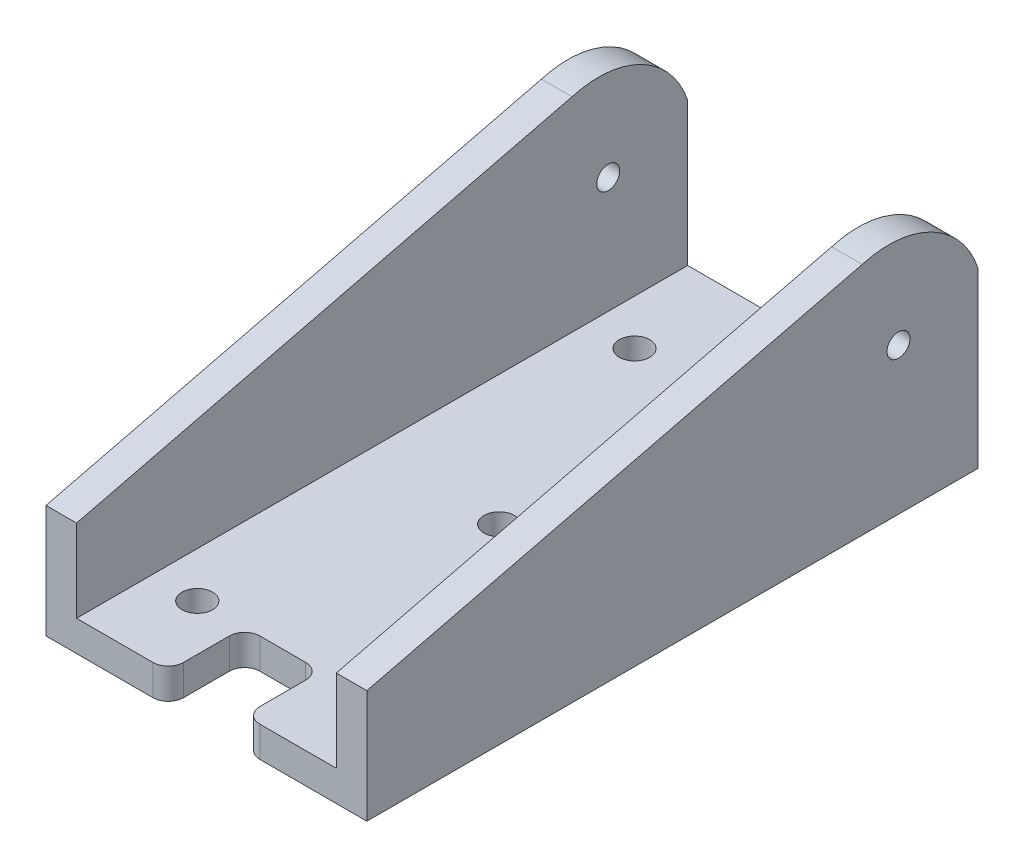
ISO-10303-21;
HEADER;
FILE_DESCRIPTION(('STEP AP214'),'2;1');
FILE_NAME('part.step','',(''),(''),'','','');
FILE_SCHEMA(('AUTOMOTIVE_DESIGN { 1 0 10303 214 1 1 1 1 }'));
ENDSEC;
DATA;
#1=APPLICATION_CONTEXT('core data for automotive mechanical design processes');
#2=APPLICATION_PROTOCOL_DEFINITION('international standard','automotive_design',2000,#1);
#3=PRODUCT_CONTEXT('',#1,'mechanical');
#4=PRODUCT('Part','Part','',(#3));
#5=PRODUCT_RELATED_PRODUCT_CATEGORY('part','',(#4));
#6=PRODUCT_DEFINITION_FORMATION('','',#4);
#7=PRODUCT_DEFINITION_CONTEXT('part definition',#1,'design');
#8=PRODUCT_DEFINITION('design','',#6,#7);
#9=PRODUCT_DEFINITION_SHAPE('','',#8);
#10=(LENGTH_UNIT() NAMED_UNIT(*) SI_UNIT(.MILLI.,.METRE.));
#11=(NAMED_UNIT(*) PLANE_ANGLE_UNIT() SI_UNIT($,.RADIAN.));
#12=(NAMED_UNIT(*) SI_UNIT($,.STERADIAN.) SOLID_ANGLE_UNIT());
#13=UNCERTAINTY_MEASURE_WITH_UNIT(LENGTH_MEASURE(1.E-05),#10,'distance_accuracy_value','');
#14=(GEOMETRIC_REPRESENTATION_CONTEXT(3) GLOBAL_UNCERTAINTY_ASSIGNED_CONTEXT((#13)) GLOBAL_UNIT_ASSIGNED_CONTEXT((#10,
#11,#12)) REPRESENTATION_CONTEXT('',''));
#15=CARTESIAN_POINT('',(0.,0.,0.));
#16=DIRECTION('',(0.,0.,1.));
#17=DIRECTION('',(1.,0.,0.));
#18=AXIS2_PLACEMENT_3D('',#15,#16,#17);
#19=CARTESIAN_POINT('',(5.25,4.72035020731188,-7.07510689997328));
#20=DIRECTION('',(-1.,0.,0.));
#21=DIRECTION('',(0.,0.,1.));
#22=AXIS2_PLACEMENT_3D('',#19,#20,#21);
#23=CYLINDRICAL_SURFACE('',#22,3.07708407349778);
#24=CARTESIAN_POINT('',(-4.25,4.72035020731188,-7.07510689997328));
#25=DIRECTION('',(1.,0.,0.));
#26=DIRECTION('',(0.,0.,-1.));
#27=AXIS2_PLACEMENT_3D('',#24,#25,#26);
#28=CIRCLE('',#27,3.07708407349778);
#29=CARTESIAN_POINT('',(-4.25,7.67432555061169,-6.21343639070045));
#30=VERTEX_POINT('',#29);
#31=CARTESIAN_POINT('',(-4.25,5.67609428853329,-10.));
#32=VERTEX_POINT('',#31);
#33=EDGE_CURVE('E231',#30,#32,#28,.F.);
#34=ORIENTED_EDGE('',*,*,#33,.T.);
#35=DIRECTION('',(-1.,0.,0.));
#36=VECTOR('',#35,1.);
#37=CARTESIAN_POINT('',(5.25,5.6760942885333,-10.));
#38=LINE('',#37,#36);
#39=CARTESIAN_POINT('',(-5.25,5.6760942885333,-10.));
#40=VERTEX_POINT('',#39);
#41=EDGE_CURVE('E198',#32,#40,#38,.T.);
#42=ORIENTED_EDGE('',*,*,#41,.T.);
#43=CARTESIAN_POINT('',(-5.25,4.72035020731188,-7.07510689997328));
#44=DIRECTION('',(1.,0.,0.));
#45=DIRECTION('',(0.,0.,-1.));
#46=AXIS2_PLACEMENT_3D('',#43,#44,#45);
#47=CIRCLE('',#46,3.07708407349778);
#48=CARTESIAN_POINT('',(-5.25,7.67432555061169,-6.21343639070045));
#49=VERTEX_POINT('',#48);
#50=EDGE_CURVE('E207',#40,#49,#47,.T.);
#51=ORIENTED_EDGE('',*,*,#50,.T.);
#52=DIRECTION('',(-1.,0.,0.));
#53=VECTOR('',#52,1.);
#54=CARTESIAN_POINT('',(5.25,7.67432555061169,-6.21343639070045));
#55=LINE('',#54,#53);
#56=EDGE_CURVE('E218',#30,#49,#55,.T.);
#57=ORIENTED_EDGE('',*,*,#56,.F.);
#58=EDGE_LOOP('',(#34,#42,#51,#57));
#59=FACE_BOUND('',#58,.T.);
#60=ADVANCED_FACE('F44',(#59),#23,.T.);
#61=CARTESIAN_POINT('',(5.25,10.,10.));
#62=DIRECTION('',(0.,0.,-1.));
#63=DIRECTION('',(-1.,0.,0.));
#64=AXIS2_PLACEMENT_3D('',#61,#62,#63);
#65=PLANE('',#64);
#66=DIRECTION('',(1.,0.,0.));
#67=VECTOR('',#66,1.);
#68=CARTESIAN_POINT('',(5.25,0.,10.));
#69=LINE('',#68,#67);
#70=CARTESIAN_POINT('',(-5.25,0.,10.));
#71=VERTEX_POINT('',#70);
#72=CARTESIAN_POINT('',(-1.75,0.,10.));
#73=VERTEX_POINT('',#72);
#74=EDGE_CURVE('E261',#71,#73,#69,.T.);
#75=ORIENTED_EDGE('',*,*,#74,.T.);
#76=DIRECTION('',(0.,-1.,0.));
#77=VECTOR('',#76,1.);
#78=CARTESIAN_POINT('',(-1.75,10.,10.));
#79=LINE('',#78,#77);
#80=CARTESIAN_POINT('',(-1.75,0.999999999999999,10.));
#81=VERTEX_POINT('',#80);
#82=EDGE_CURVE('E295',#73,#81,#79,.F.);
#83=ORIENTED_EDGE('',*,*,#82,.T.);
#84=DIRECTION('',(1.,0.,0.));
#85=VECTOR('',#84,1.);
#86=CARTESIAN_POINT('',(5.25,0.999999999999999,10.));
#87=LINE('',#86,#85);
#88=CARTESIAN_POINT('',(-4.25,1.,10.));
#89=VERTEX_POINT('',#88);
#90=EDGE_CURVE('E252',#89,#81,#87,.T.);
#91=ORIENTED_EDGE('',*,*,#90,.F.);
#92=DIRECTION('',(0.,-1.,0.));
#93=VECTOR('',#92,1.);
#94=CARTESIAN_POINT('',(-4.25,10.,10.));
#95=LINE('',#94,#93);
#96=CARTESIAN_POINT('',(-4.25,3.69945515693264,10.));
#97=VERTEX_POINT('',#96);
#98=EDGE_CURVE('E180',#97,#89,#95,.T.);
#99=ORIENTED_EDGE('',*,*,#98,.F.);
#100=DIRECTION('',(-1.,0.,0.));
#101=VECTOR('',#100,1.);
#102=CARTESIAN_POINT('',(5.25,3.69945515693264,10.));
#103=LINE('',#102,#101);
#104=CARTESIAN_POINT('',(-5.25,3.69945515693264,10.));
#105=VERTEX_POINT('',#104);
#106=EDGE_CURVE('E226',#97,#105,#103,.T.);
#107=ORIENTED_EDGE('',*,*,#106,.T.);
#108=DIRECTION('',(0.,-1.,0.));
#109=VECTOR('',#108,1.);
#110=CARTESIAN_POINT('',(-5.25,10.,10.));
#111=LINE('',#110,#109);
#112=EDGE_CURVE('E277',#105,#71,#111,.T.);
#113=ORIENTED_EDGE('',*,*,#112,.T.);
#114=EDGE_LOOP('',(#75,#83,#91,#99,#107,#113));
#115=FACE_BOUND('',#114,.T.);
#116=ADVANCED_FACE('F365',(#115),#65,.F.);
#117=CARTESIAN_POINT('',(1.75,0.999999999999999,10.));
#118=VERTEX_POINT('',#117);
#119=CARTESIAN_POINT('',(4.25,1.,10.));
#120=VERTEX_POINT('',#119);
#121=EDGE_CURVE('E183',#118,#120,#87,.T.);
#122=ORIENTED_EDGE('',*,*,#121,.F.);
#123=DIRECTION('',(0.,-1.,0.));
#124=VECTOR('',#123,1.);
#125=CARTESIAN_POINT('',(1.75,10.,10.));
#126=LINE('',#125,#124);
#127=CARTESIAN_POINT('',(1.75,0.,10.));
#128=VERTEX_POINT('',#127);
#129=EDGE_CURVE('E300',#118,#128,#126,.T.);
#130=ORIENTED_EDGE('',*,*,#129,.T.);
#131=CARTESIAN_POINT('',(5.25,0.,10.));
#132=VERTEX_POINT('',#131);
#133=EDGE_CURVE('E260',#128,#132,#69,.T.);
#134=ORIENTED_EDGE('',*,*,#133,.T.);
#135=DIRECTION('',(0.,-1.,0.));
#136=VECTOR('',#135,1.);
#137=CARTESIAN_POINT('',(5.25,10.,10.));
#138=LINE('',#137,#136);
#139=CARTESIAN_POINT('',(5.25,3.69945515693264,10.));
#140=VERTEX_POINT('',#139);
#141=EDGE_CURVE('E274',#140,#132,#138,.T.);
#142=ORIENTED_EDGE('',*,*,#141,.F.);
#143=CARTESIAN_POINT('',(4.25,3.69945515693264,10.));
#144=VERTEX_POINT('',#143);
#145=EDGE_CURVE('E223',#140,#144,#103,.T.);
#146=ORIENTED_EDGE('',*,*,#145,.T.);
#147=DIRECTION('',(0.,-1.,0.));
#148=VECTOR('',#147,1.);
#149=CARTESIAN_POINT('',(4.25,10.,10.));
#150=LINE('',#149,#148);
#151=EDGE_CURVE('E251',#144,#120,#150,.T.);
#152=ORIENTED_EDGE('',*,*,#151,.T.);
#153=EDGE_LOOP('',(#122,#130,#134,#142,#146,#152));
#154=FACE_BOUND('',#153,.T.);
#155=ADVANCED_FACE('F330',(#154),#65,.F.);
#156=CARTESIAN_POINT('',(-5.25,10.,10.));
#157=DIRECTION('',(1.,0.,0.));
#158=DIRECTION('',(0.,0.,-1.));
#159=AXIS2_PLACEMENT_3D('',#156,#157,#158);
#160=PLANE('',#159);
#161=CARTESIAN_POINT('',(-5.25,4.79610799591964,-7.39805085385863));
#162=DIRECTION('',(1.,0.,0.));
#163=DIRECTION('',(0.,0.,-1.));
#164=AXIS2_PLACEMENT_3D('',#161,#162,#163);
#165=CIRCLE('',#164,0.375);
#166=CARTESIAN_POINT('',(-5.25,4.79610799591964,-7.77305085385863));
#167=VERTEX_POINT('',#166);
#168=EDGE_CURVE('E199',#167,#167,#165,.T.);
#169=ORIENTED_EDGE('',*,*,#168,.T.);
#170=EDGE_LOOP('',(#169));
#171=FACE_BOUND('',#170,.T.);
#172=DIRECTION('',(0.,-0.238107940431499,0.971238698108487));
#173=VECTOR('',#172,1.);
#174=CARTESIAN_POINT('',(-5.25,7.67432555061169,-6.21343639070045));
#175=LINE('',#174,#173);
#176=EDGE_CURVE('E210',#49,#105,#175,.T.);
#177=ORIENTED_EDGE('',*,*,#176,.F.);
#178=ORIENTED_EDGE('',*,*,#50,.F.);
#179=DIRECTION('',(0.,-1.,0.));
#180=VECTOR('',#179,1.);
#181=CARTESIAN_POINT('',(-5.25,10.,-10.));
#182=LINE('',#181,#180);
#183=CARTESIAN_POINT('',(-5.25,0.,-10.));
#184=VERTEX_POINT('',#183);
#185=EDGE_CURVE('E270',#40,#184,#182,.T.);
#186=ORIENTED_EDGE('',*,*,#185,.T.);
#187=DIRECTION('',(0.,0.,1.));
#188=VECTOR('',#187,1.);
#189=CARTESIAN_POINT('',(-5.25,0.,10.));
#190=LINE('',#189,#188);
#191=EDGE_CURVE('E254',#184,#71,#190,.T.);
#192=ORIENTED_EDGE('',*,*,#191,.T.);
#193=ORIENTED_EDGE('',*,*,#112,.F.);
#194=EDGE_LOOP('',(#177,#178,#186,#192,#193));
#195=FACE_BOUND('',#194,.T.);
#196=ADVANCED_FACE('F395',(#171,#195),#160,.F.);
#197=CARTESIAN_POINT('',(5.25,10.,10.));
#198=DIRECTION('',(-1.,0.,0.));
#199=DIRECTION('',(0.,0.,1.));
#200=AXIS2_PLACEMENT_3D('',#197,#198,#199);
#201=PLANE('',#200);
#202=CARTESIAN_POINT('',(5.25,4.79610799591964,-7.39805085385863));
#203=DIRECTION('',(-1.,0.,0.));
#204=DIRECTION('',(0.,0.,1.));
#205=AXIS2_PLACEMENT_3D('',#202,#203,#204);
#206=CIRCLE('',#205,0.375);
#207=CARTESIAN_POINT('',(5.25,4.79610799591964,-7.02305085385863));
#208=VERTEX_POINT('',#207);
#209=EDGE_CURVE('E476',#208,#208,#206,.T.);
#210=ORIENTED_EDGE('',*,*,#209,.T.);
#211=EDGE_LOOP('',(#210));
#212=FACE_BOUND('',#211,.T.);
#213=DIRECTION('',(0.,-1.,0.));
#214=VECTOR('',#213,1.);
#215=CARTESIAN_POINT('',(5.25,10.,-10.));
#216=LINE('',#215,#214);
#217=CARTESIAN_POINT('',(5.25,5.6760942885333,-10.));
#218=VERTEX_POINT('',#217);
#219=CARTESIAN_POINT('',(5.25,0.,-10.));
#220=VERTEX_POINT('',#219);
#221=EDGE_CURVE('E272',#218,#220,#216,.T.);
#222=ORIENTED_EDGE('',*,*,#221,.F.);
#223=CARTESIAN_POINT('',(5.25,4.72035020731188,-7.07510689997328));
#224=DIRECTION('',(1.,0.,0.));
#225=DIRECTION('',(0.,0.,-1.));
#226=AXIS2_PLACEMENT_3D('',#223,#224,#225);
#227=CIRCLE('',#226,3.07708407349778);
#228=CARTESIAN_POINT('',(5.25,7.67432555061169,-6.21343639070045));
#229=VERTEX_POINT('',#228);
#230=EDGE_CURVE('E212',#218,#229,#227,.T.);
#231=ORIENTED_EDGE('',*,*,#230,.T.);
#232=DIRECTION('',(0.,-0.238107940431499,0.971238698108487));
#233=VECTOR('',#232,1.);
#234=CARTESIAN_POINT('',(5.25,7.67432555061169,-6.21343639070045));
#235=LINE('',#234,#233);
#236=EDGE_CURVE('E215',#229,#140,#235,.T.);
#237=ORIENTED_EDGE('',*,*,#236,.T.);
#238=ORIENTED_EDGE('',*,*,#141,.T.);
#239=DIRECTION('',(0.,0.,-1.));
#240=VECTOR('',#239,1.);
#241=CARTESIAN_POINT('',(5.25,0.,10.));
#242=LINE('',#241,#240);
#243=EDGE_CURVE('E264',#132,#220,#242,.T.);
#244=ORIENTED_EDGE('',*,*,#243,.T.);
#245=EDGE_LOOP('',(#222,#231,#237,#238,#244));
#246=FACE_BOUND('',#245,.T.);
#247=ADVANCED_FACE('F337',(#212,#246),#201,.F.);
#248=CARTESIAN_POINT('',(5.25,10.,-10.));
#249=DIRECTION('',(0.,0.,1.));
#250=DIRECTION('',(1.,0.,0.));
#251=AXIS2_PLACEMENT_3D('',#248,#249,#250);
#252=PLANE('',#251);
#253=ORIENTED_EDGE('',*,*,#41,.F.);
#254=DIRECTION('',(0.,-1.,0.));
#255=VECTOR('',#254,1.);
#256=CARTESIAN_POINT('',(-4.25,7.12102364383822,-10.));
#257=LINE('',#256,#255);
#258=CARTESIAN_POINT('',(-4.25,1.,-10.));
#259=VERTEX_POINT('',#258);
#260=EDGE_CURVE('E176',#32,#259,#257,.T.);
#261=ORIENTED_EDGE('',*,*,#260,.T.);
#262=DIRECTION('',(1.,0.,0.));
#263=VECTOR('',#262,1.);
#264=CARTESIAN_POINT('',(-4.25,1.,-10.));
#265=LINE('',#264,#263);
#266=CARTESIAN_POINT('',(4.25,1.,-10.));
#267=VERTEX_POINT('',#266);
#268=EDGE_CURVE('E187',#259,#267,#265,.T.);
#269=ORIENTED_EDGE('',*,*,#268,.T.);
#270=DIRECTION('',(0.,1.,0.));
#271=VECTOR('',#270,1.);
#272=CARTESIAN_POINT('',(4.25,7.12102364383822,-10.));
#273=LINE('',#272,#271);
#274=CARTESIAN_POINT('',(4.25,5.67609428853329,-10.));
#275=VERTEX_POINT('',#274);
#276=EDGE_CURVE('E194',#267,#275,#273,.T.);
#277=ORIENTED_EDGE('',*,*,#276,.T.);
#278=EDGE_CURVE('E219',#218,#275,#38,.T.);
#279=ORIENTED_EDGE('',*,*,#278,.F.);
#280=ORIENTED_EDGE('',*,*,#221,.T.);
#281=DIRECTION('',(-1.,0.,0.));
#282=VECTOR('',#281,1.);
#283=CARTESIAN_POINT('',(5.25,0.,-10.));
#284=LINE('',#283,#282);
#285=EDGE_CURVE('E267',#220,#184,#284,.T.);
#286=ORIENTED_EDGE('',*,*,#285,.T.);
#287=ORIENTED_EDGE('',*,*,#185,.F.);
#288=EDGE_LOOP('',(#253,#261,#269,#277,#279,#280,#286,#287));
#289=FACE_BOUND('',#288,.T.);
#290=ADVANCED_FACE('F196',(#289),#252,.F.);
#291=CARTESIAN_POINT('',(0.,0.,0.));
#292=DIRECTION('',(0.,1.,0.));
#293=DIRECTION('',(0.,0.,1.));
#294=AXIS2_PLACEMENT_3D('',#291,#292,#293);
#295=PLANE('',#294);
#296=CARTESIAN_POINT('',(2.76704696370651,0.,-6.77686191855663));
#297=DIRECTION('',(0.,1.,0.));
#298=DIRECTION('',(0.,0.,1.));
#299=AXIS2_PLACEMENT_3D('',#296,#297,#298);
#300=CIRCLE('',#299,0.5);
#301=CARTESIAN_POINT('',(2.76704696370651,0.,-6.27686191855664));
#302=VERTEX_POINT('',#301);
#303=EDGE_CURVE('E472',#302,#302,#300,.T.);
#304=ORIENTED_EDGE('',*,*,#303,.T.);
#305=EDGE_LOOP('',(#304));
#306=FACE_BOUND('',#305,.T.);
#307=CARTESIAN_POINT('',(-2.76704696370652,0.,-6.77686191855663));
#308=DIRECTION('',(0.,1.,0.));
#309=DIRECTION('',(0.,0.,1.));
#310=AXIS2_PLACEMENT_3D('',#307,#308,#309);
#311=CIRCLE('',#310,0.5);
#312=CARTESIAN_POINT('',(-2.76704696370652,0.,-6.27686191855664));
#313=VERTEX_POINT('',#312);
#314=EDGE_CURVE('E466',#313,#313,#311,.T.);
#315=ORIENTED_EDGE('',*,*,#314,.T.);
#316=EDGE_LOOP('',(#315));
#317=FACE_BOUND('',#316,.T.);
#318=CARTESIAN_POINT('',(-2.76704696370652,0.,7.53213528334008));
#319=DIRECTION('',(0.,1.,0.));
#320=DIRECTION('',(0.,0.,1.));
#321=AXIS2_PLACEMENT_3D('',#318,#319,#320);
#322=CIRCLE('',#321,0.5);
#323=CARTESIAN_POINT('',(-2.76704696370652,0.,8.03213528334008));
#324=VERTEX_POINT('',#323);
#325=EDGE_CURVE('E460',#324,#324,#322,.T.);
#326=ORIENTED_EDGE('',*,*,#325,.T.);
#327=EDGE_LOOP('',(#326));
#328=FACE_BOUND('',#327,.T.);
#329=CARTESIAN_POINT('',(2.76704696370651,0.,7.61452874131646));
#330=DIRECTION('',(0.,1.,0.));
#331=DIRECTION('',(0.,0.,1.));
#332=AXIS2_PLACEMENT_3D('',#329,#330,#331);
#333=CIRCLE('',#332,0.5);
#334=CARTESIAN_POINT('',(2.76704696370651,0.,8.11452874131646));
#335=VERTEX_POINT('',#334);
#336=EDGE_CURVE('E445',#335,#335,#333,.T.);
#337=ORIENTED_EDGE('',*,*,#336,.T.);
#338=EDGE_LOOP('',(#337));
#339=FACE_BOUND('',#338,.T.);
#340=CARTESIAN_POINT('',(0.,0.,0.418833411379911));
#341=DIRECTION('',(0.,1.,0.));
#342=DIRECTION('',(0.,0.,1.));
#343=AXIS2_PLACEMENT_3D('',#340,#341,#342);
#344=CIRCLE('',#343,0.5);
#345=CARTESIAN_POINT('',(0.,0.,0.918833411379911));
#346=VERTEX_POINT('',#345);
#347=EDGE_CURVE('E453',#346,#346,#344,.T.);
#348=ORIENTED_EDGE('',*,*,#347,.T.);
#349=EDGE_LOOP('',(#348));
#350=FACE_BOUND('',#349,.T.);
#351=DIRECTION('',(0.,0.,-1.));
#352=VECTOR('',#351,1.);
#353=CARTESIAN_POINT('',(-1.25,0.,10.));
#354=LINE('',#353,#352);
#355=CARTESIAN_POINT('',(-1.25,0.,9.5));
#356=VERTEX_POINT('',#355);
#357=CARTESIAN_POINT('',(-1.25,0.,8.));
#358=VERTEX_POINT('',#357);
#359=EDGE_CURVE('E245',#356,#358,#354,.T.);
#360=ORIENTED_EDGE('',*,*,#359,.F.);
#361=CARTESIAN_POINT('',(-1.75,0.,9.5));
#362=DIRECTION('',(0.,1.,0.));
#363=DIRECTION('',(0.,0.,1.));
#364=AXIS2_PLACEMENT_3D('',#361,#362,#363);
#365=CIRCLE('',#364,0.5);
#366=EDGE_CURVE('E293',#356,#73,#365,.F.);
#367=ORIENTED_EDGE('',*,*,#366,.T.);
#368=ORIENTED_EDGE('',*,*,#74,.F.);
#369=ORIENTED_EDGE('',*,*,#191,.F.);
#370=ORIENTED_EDGE('',*,*,#285,.F.);
#371=ORIENTED_EDGE('',*,*,#243,.F.);
#372=ORIENTED_EDGE('',*,*,#133,.F.);
#373=CARTESIAN_POINT('',(1.75,0.,9.5));
#374=DIRECTION('',(0.,1.,0.));
#375=DIRECTION('',(0.,0.,1.));
#376=AXIS2_PLACEMENT_3D('',#373,#374,#375);
#377=CIRCLE('',#376,0.5);
#378=CARTESIAN_POINT('',(1.25,0.,9.5));
#379=VERTEX_POINT('',#378);
#380=EDGE_CURVE('E291',#128,#379,#377,.F.);
#381=ORIENTED_EDGE('',*,*,#380,.T.);
#382=DIRECTION('',(0.,0.,1.));
#383=VECTOR('',#382,1.);
#384=CARTESIAN_POINT('',(1.25,0.,10.));
#385=LINE('',#384,#383);
#386=CARTESIAN_POINT('',(1.25,0.,8.));
#387=VERTEX_POINT('',#386);
#388=EDGE_CURVE('E235',#387,#379,#385,.T.);
#389=ORIENTED_EDGE('',*,*,#388,.F.);
#390=CARTESIAN_POINT('',(0.75,0.,8.));
#391=DIRECTION('',(0.,1.,0.));
#392=DIRECTION('',(0.,0.,1.));
#393=AXIS2_PLACEMENT_3D('',#390,#391,#392);
#394=CIRCLE('',#393,0.5);
#395=CARTESIAN_POINT('',(0.75,0.,7.5));
#396=VERTEX_POINT('',#395);
#397=EDGE_CURVE('E53',#387,#396,#394,.T.);
#398=ORIENTED_EDGE('',*,*,#397,.T.);
#399=DIRECTION('',(1.,0.,0.));
#400=VECTOR('',#399,1.);
#401=CARTESIAN_POINT('',(1.25,0.,7.5));
#402=LINE('',#401,#400);
#403=CARTESIAN_POINT('',(-0.75,0.,7.5));
#404=VERTEX_POINT('',#403);
#405=EDGE_CURVE('E239',#404,#396,#402,.T.);
#406=ORIENTED_EDGE('',*,*,#405,.F.);
#407=CARTESIAN_POINT('',(-0.75,0.,8.));
#408=DIRECTION('',(0.,1.,0.));
#409=DIRECTION('',(0.,0.,1.));
#410=AXIS2_PLACEMENT_3D('',#407,#408,#409);
#411=CIRCLE('',#410,0.5);
#412=EDGE_CURVE('E307',#404,#358,#411,.T.);
#413=ORIENTED_EDGE('',*,*,#412,.T.);
#414=EDGE_LOOP('',(#360,#367,#368,#369,#370,#371,#372,#381,#389,#398,#406,#413));
#415=FACE_BOUND('',#414,.T.);
#416=ADVANCED_FACE('F315',(#306,#317,#328,#339,#350,#415),#295,.F.);
#417=CARTESIAN_POINT('',(-4.25,10.,10.));
#418=DIRECTION('',(1.,0.,0.));
#419=DIRECTION('',(0.,0.,-1.));
#420=AXIS2_PLACEMENT_3D('',#417,#418,#419);
#421=PLANE('',#420);
#422=CARTESIAN_POINT('',(-4.25,4.79610799591964,-7.39805085385863));
#423=DIRECTION('',(1.,0.,0.));
#424=DIRECTION('',(0.,0.,-1.));
#425=AXIS2_PLACEMENT_3D('',#422,#423,#424);
#426=CIRCLE('',#425,0.375);
#427=CARTESIAN_POINT('',(-4.25,4.79610799591964,-7.77305085385863));
#428=VERTEX_POINT('',#427);
#429=EDGE_CURVE('E202',#428,#428,#426,.T.);
#430=ORIENTED_EDGE('',*,*,#429,.F.);
#431=EDGE_LOOP('',(#430));
#432=FACE_BOUND('',#431,.T.);
#433=ORIENTED_EDGE('',*,*,#33,.F.);
#434=DIRECTION('',(0.,0.238107940431499,-0.971238698108487));
#435=VECTOR('',#434,1.);
#436=CARTESIAN_POINT('',(-4.25,4.05666701219168,8.54293822951898));
#437=LINE('',#436,#435);
#438=EDGE_CURVE('E233',#97,#30,#437,.T.);
#439=ORIENTED_EDGE('',*,*,#438,.F.);
#440=ORIENTED_EDGE('',*,*,#98,.T.);
#441=DIRECTION('',(0.,0.,1.));
#442=VECTOR('',#441,1.);
#443=CARTESIAN_POINT('',(-4.25,0.999999999999999,10.));
#444=LINE('',#443,#442);
#445=EDGE_CURVE('E171',#259,#89,#444,.T.);
#446=ORIENTED_EDGE('',*,*,#445,.F.);
#447=ORIENTED_EDGE('',*,*,#260,.F.);
#448=EDGE_LOOP('',(#433,#439,#440,#446,#447));
#449=FACE_BOUND('',#448,.T.);
#450=ADVANCED_FACE('F174',(#432,#449),#421,.T.);
#451=CARTESIAN_POINT('',(4.25,10.,10.));
#452=DIRECTION('',(-1.,0.,0.));
#453=DIRECTION('',(0.,0.,1.));
#454=AXIS2_PLACEMENT_3D('',#451,#452,#453);
#455=PLANE('',#454);
#456=CARTESIAN_POINT('',(4.25,4.79610799591964,-7.39805085385863));
#457=DIRECTION('',(-1.,0.,0.));
#458=DIRECTION('',(0.,0.,1.));
#459=AXIS2_PLACEMENT_3D('',#456,#457,#458);
#460=CIRCLE('',#459,0.375);
#461=CARTESIAN_POINT('',(4.25,4.79610799591964,-7.02305085385863));
#462=VERTEX_POINT('',#461);
#463=EDGE_CURVE('E48',#462,#462,#460,.T.);
#464=ORIENTED_EDGE('',*,*,#463,.F.);
#465=EDGE_LOOP('',(#464));
#466=FACE_BOUND('',#465,.T.);
#467=CARTESIAN_POINT('',(4.25,4.72035020731188,-7.07510689997328));
#468=DIRECTION('',(-1.,0.,0.));
#469=DIRECTION('',(0.,0.,1.));
#470=AXIS2_PLACEMENT_3D('',#467,#468,#469);
#471=CIRCLE('',#470,3.07708407349778);
#472=CARTESIAN_POINT('',(4.25,7.67432555061169,-6.21343639070045));
#473=VERTEX_POINT('',#472);
#474=EDGE_CURVE('E222',#275,#473,#471,.F.);
#475=ORIENTED_EDGE('',*,*,#474,.F.);
#476=ORIENTED_EDGE('',*,*,#276,.F.);
#477=DIRECTION('',(0.,0.,-1.));
#478=VECTOR('',#477,1.);
#479=CARTESIAN_POINT('',(4.25,0.999999999999999,10.));
#480=LINE('',#479,#478);
#481=EDGE_CURVE('E190',#120,#267,#480,.T.);
#482=ORIENTED_EDGE('',*,*,#481,.F.);
#483=ORIENTED_EDGE('',*,*,#151,.F.);
#484=DIRECTION('',(0.,-0.238107940431499,0.971238698108487));
#485=VECTOR('',#484,1.);
#486=CARTESIAN_POINT('',(4.25,4.05666701219168,8.54293822951898));
#487=LINE('',#486,#485);
#488=EDGE_CURVE('E279',#473,#144,#487,.T.);
#489=ORIENTED_EDGE('',*,*,#488,.F.);
#490=EDGE_LOOP('',(#475,#476,#482,#483,#489));
#491=FACE_BOUND('',#490,.T.);
#492=ADVANCED_FACE('F343',(#466,#491),#455,.T.);
#493=CARTESIAN_POINT('',(0.,1.,0.));
#494=DIRECTION('',(0.,1.,0.));
#495=DIRECTION('',(0.,0.,1.));
#496=AXIS2_PLACEMENT_3D('',#493,#494,#495);
#497=PLANE('',#496);
#498=CARTESIAN_POINT('',(2.76704696370651,1.,-6.77686191855663));
#499=DIRECTION('',(0.,1.,0.));
#500=DIRECTION('',(0.,0.,1.));
#501=AXIS2_PLACEMENT_3D('',#498,#499,#500);
#502=CIRCLE('',#501,0.5);
#503=CARTESIAN_POINT('',(2.76704696370651,1.,-6.27686191855664));
#504=VERTEX_POINT('',#503);
#505=EDGE_CURVE('E469',#504,#504,#502,.T.);
#506=ORIENTED_EDGE('',*,*,#505,.F.);
#507=EDGE_LOOP('',(#506));
#508=FACE_BOUND('',#507,.T.);
#509=CARTESIAN_POINT('',(-2.76704696370652,1.,-6.77686191855663));
#510=DIRECTION('',(0.,1.,0.));
#511=DIRECTION('',(0.,0.,1.));
#512=AXIS2_PLACEMENT_3D('',#509,#510,#511);
#513=CIRCLE('',#512,0.5);
#514=CARTESIAN_POINT('',(-2.76704696370652,1.,-6.27686191855664));
#515=VERTEX_POINT('',#514);
#516=EDGE_CURVE('E463',#515,#515,#513,.T.);
#517=ORIENTED_EDGE('',*,*,#516,.F.);
#518=EDGE_LOOP('',(#517));
#519=FACE_BOUND('',#518,.T.);
#520=CARTESIAN_POINT('',(-2.76704696370652,1.,7.53213528334008));
#521=DIRECTION('',(0.,1.,0.));
#522=DIRECTION('',(0.,0.,1.));
#523=AXIS2_PLACEMENT_3D('',#520,#521,#522);
#524=CIRCLE('',#523,0.5);
#525=CARTESIAN_POINT('',(-2.76704696370652,1.,8.03213528334008));
#526=VERTEX_POINT('',#525);
#527=EDGE_CURVE('E455',#526,#526,#524,.T.);
#528=ORIENTED_EDGE('',*,*,#527,.F.);
#529=EDGE_LOOP('',(#528));
#530=FACE_BOUND('',#529,.T.);
#531=CARTESIAN_POINT('',(2.76704696370651,1.,7.61452874131646));
#532=DIRECTION('',(0.,1.,0.));
#533=DIRECTION('',(0.,0.,1.));
#534=AXIS2_PLACEMENT_3D('',#531,#532,#533);
#535=CIRCLE('',#534,0.5);
#536=CARTESIAN_POINT('',(2.76704696370651,1.,8.11452874131646));
#537=VERTEX_POINT('',#536);
#538=EDGE_CURVE('E448',#537,#537,#535,.T.);
#539=ORIENTED_EDGE('',*,*,#538,.F.);
#540=EDGE_LOOP('',(#539));
#541=FACE_BOUND('',#540,.T.);
#542=CARTESIAN_POINT('',(0.,1.,0.418833411379911));
#543=DIRECTION('',(0.,1.,0.));
#544=DIRECTION('',(0.,0.,1.));
#545=AXIS2_PLACEMENT_3D('',#542,#543,#544);
#546=CIRCLE('',#545,0.5);
#547=CARTESIAN_POINT('',(0.,1.,0.918833411379911));
#548=VERTEX_POINT('',#547);
#549=EDGE_CURVE('E450',#548,#548,#546,.T.);
#550=ORIENTED_EDGE('',*,*,#549,.F.);
#551=EDGE_LOOP('',(#550));
#552=FACE_BOUND('',#551,.T.);
#553=ORIENTED_EDGE('',*,*,#90,.T.);
#554=CARTESIAN_POINT('',(-1.75,1.,9.5));
#555=DIRECTION('',(0.,1.,0.));
#556=DIRECTION('',(0.,0.,1.));
#557=AXIS2_PLACEMENT_3D('',#554,#555,#556);
#558=CIRCLE('',#557,0.5);
#559=CARTESIAN_POINT('',(-1.25,1.,9.5));
#560=VERTEX_POINT('',#559);
#561=EDGE_CURVE('E298',#81,#560,#558,.T.);
#562=ORIENTED_EDGE('',*,*,#561,.T.);
#563=DIRECTION('',(0.,0.,-1.));
#564=VECTOR('',#563,1.);
#565=CARTESIAN_POINT('',(-1.25,1.,10.));
#566=LINE('',#565,#564);
#567=CARTESIAN_POINT('',(-1.25,1.,8.));
#568=VERTEX_POINT('',#567);
#569=EDGE_CURVE('E238',#560,#568,#566,.T.);
#570=ORIENTED_EDGE('',*,*,#569,.T.);
#571=CARTESIAN_POINT('',(-0.75,1.,8.));
#572=DIRECTION('',(0.,1.,0.));
#573=DIRECTION('',(0.,0.,1.));
#574=AXIS2_PLACEMENT_3D('',#571,#572,#573);
#575=CIRCLE('',#574,0.5);
#576=CARTESIAN_POINT('',(-0.75,1.,7.5));
#577=VERTEX_POINT('',#576);
#578=EDGE_CURVE('E309',#568,#577,#575,.F.);
#579=ORIENTED_EDGE('',*,*,#578,.T.);
#580=DIRECTION('',(1.,0.,0.));
#581=VECTOR('',#580,1.);
#582=CARTESIAN_POINT('',(1.25,1.,7.5));
#583=LINE('',#582,#581);
#584=CARTESIAN_POINT('',(0.75,1.,7.5));
#585=VERTEX_POINT('',#584);
#586=EDGE_CURVE('E184',#577,#585,#583,.T.);
#587=ORIENTED_EDGE('',*,*,#586,.T.);
#588=CARTESIAN_POINT('',(0.75,1.,8.));
#589=DIRECTION('',(0.,1.,0.));
#590=DIRECTION('',(0.,0.,1.));
#591=AXIS2_PLACEMENT_3D('',#588,#589,#590);
#592=CIRCLE('',#591,0.5);
#593=CARTESIAN_POINT('',(1.25,1.,8.));
#594=VERTEX_POINT('',#593);
#595=EDGE_CURVE('E11',#585,#594,#592,.F.);
#596=ORIENTED_EDGE('',*,*,#595,.T.);
#597=DIRECTION('',(0.,0.,1.));
#598=VECTOR('',#597,1.);
#599=CARTESIAN_POINT('',(1.25,1.,10.));
#600=LINE('',#599,#598);
#601=CARTESIAN_POINT('',(1.25,1.,9.5));
#602=VERTEX_POINT('',#601);
#603=EDGE_CURVE('E236',#594,#602,#600,.T.);
#604=ORIENTED_EDGE('',*,*,#603,.T.);
#605=CARTESIAN_POINT('',(1.75,0.999999999999999,9.5));
#606=DIRECTION('',(0.,1.,0.));
#607=DIRECTION('',(0.,0.,1.));
#608=AXIS2_PLACEMENT_3D('',#605,#606,#607);
#609=CIRCLE('',#608,0.5);
#610=EDGE_CURVE('E60',#602,#118,#609,.T.);
#611=ORIENTED_EDGE('',*,*,#610,.T.);
#612=ORIENTED_EDGE('',*,*,#121,.T.);
#613=ORIENTED_EDGE('',*,*,#481,.T.);
#614=ORIENTED_EDGE('',*,*,#268,.F.);
#615=ORIENTED_EDGE('',*,*,#445,.T.);
#616=EDGE_LOOP('',(#553,#562,#570,#579,#587,#596,#604,#611,#612,#613,#614,#615));
#617=FACE_BOUND('',#616,.T.);
#618=ADVANCED_FACE('F188',(#508,#519,#530,#541,#552,#617),#497,.T.);
#619=CARTESIAN_POINT('',(1.25,1.,10.));
#620=DIRECTION('',(1.,0.,0.));
#621=DIRECTION('',(0.,0.,-1.));
#622=AXIS2_PLACEMENT_3D('',#619,#620,#621);
#623=PLANE('',#622);
#624=ORIENTED_EDGE('',*,*,#388,.T.);
#625=DIRECTION('',(0.,-1.,0.));
#626=VECTOR('',#625,1.);
#627=CARTESIAN_POINT('',(1.25,1.,9.5));
#628=LINE('',#627,#626);
#629=EDGE_CURVE('E68',#379,#602,#628,.F.);
#630=ORIENTED_EDGE('',*,*,#629,.T.);
#631=ORIENTED_EDGE('',*,*,#603,.F.);
#632=DIRECTION('',(0.,-1.,0.));
#633=VECTOR('',#632,1.);
#634=CARTESIAN_POINT('',(1.25,0.,8.));
#635=LINE('',#634,#633);
#636=EDGE_CURVE('E303',#594,#387,#635,.T.);
#637=ORIENTED_EDGE('',*,*,#636,.T.);
#638=EDGE_LOOP('',(#624,#630,#631,#637));
#639=FACE_BOUND('',#638,.T.);
#640=ADVANCED_FACE('F324',(#639),#623,.F.);
#641=CARTESIAN_POINT('',(1.25,1.,7.5));
#642=DIRECTION('',(0.,0.,-1.));
#643=DIRECTION('',(-1.,0.,0.));
#644=AXIS2_PLACEMENT_3D('',#641,#642,#643);
#645=PLANE('',#644);
#646=ORIENTED_EDGE('',*,*,#586,.F.);
#647=DIRECTION('',(0.,-1.,0.));
#648=VECTOR('',#647,1.);
#649=CARTESIAN_POINT('',(-0.75,0.,7.5));
#650=LINE('',#649,#648);
#651=EDGE_CURVE('E283',#577,#404,#650,.T.);
#652=ORIENTED_EDGE('',*,*,#651,.T.);
#653=ORIENTED_EDGE('',*,*,#405,.T.);
#654=DIRECTION('',(0.,-1.,0.));
#655=VECTOR('',#654,1.);
#656=CARTESIAN_POINT('',(0.75,1.,7.5));
#657=LINE('',#656,#655);
#658=EDGE_CURVE('E281',#396,#585,#657,.F.);
#659=ORIENTED_EDGE('',*,*,#658,.T.);
#660=EDGE_LOOP('',(#646,#652,#653,#659));
#661=FACE_BOUND('',#660,.T.);
#662=ADVANCED_FACE('F321',(#661),#645,.F.);
#663=CARTESIAN_POINT('',(-1.25,1.,10.));
#664=DIRECTION('',(-1.,0.,0.));
#665=DIRECTION('',(0.,0.,1.));
#666=AXIS2_PLACEMENT_3D('',#663,#664,#665);
#667=PLANE('',#666);
#668=ORIENTED_EDGE('',*,*,#359,.T.);
#669=DIRECTION('',(0.,-1.,0.));
#670=VECTOR('',#669,1.);
#671=CARTESIAN_POINT('',(-1.25,1.,8.));
#672=LINE('',#671,#670);
#673=EDGE_CURVE('E289',#358,#568,#672,.F.);
#674=ORIENTED_EDGE('',*,*,#673,.T.);
#675=ORIENTED_EDGE('',*,*,#569,.F.);
#676=DIRECTION('',(0.,-1.,0.));
#677=VECTOR('',#676,1.);
#678=CARTESIAN_POINT('',(-1.25,1.,9.5));
#679=LINE('',#678,#677);
#680=EDGE_CURVE('E286',#560,#356,#679,.T.);
#681=ORIENTED_EDGE('',*,*,#680,.T.);
#682=EDGE_LOOP('',(#668,#674,#675,#681));
#683=FACE_BOUND('',#682,.T.);
#684=ADVANCED_FACE('F362',(#683),#667,.F.);
#685=CARTESIAN_POINT('',(5.25,7.67432555061169,-6.21343639070045));
#686=DIRECTION('',(0.,-0.971238698108488,-0.238107940431499));
#687=DIRECTION('',(0.,0.238107940431499,-0.971238698108487));
#688=AXIS2_PLACEMENT_3D('',#685,#686,#687);
#689=PLANE('',#688);
#690=ORIENTED_EDGE('',*,*,#438,.T.);
#691=ORIENTED_EDGE('',*,*,#56,.T.);
#692=ORIENTED_EDGE('',*,*,#176,.T.);
#693=ORIENTED_EDGE('',*,*,#106,.F.);
#694=EDGE_LOOP('',(#690,#691,#692,#693));
#695=FACE_BOUND('',#694,.T.);
#696=ADVANCED_FACE('F351',(#695),#689,.F.);
#697=ORIENTED_EDGE('',*,*,#278,.T.);
#698=ORIENTED_EDGE('',*,*,#474,.T.);
#699=EDGE_CURVE('E227',#229,#473,#55,.T.);
#700=ORIENTED_EDGE('',*,*,#699,.F.);
#701=ORIENTED_EDGE('',*,*,#230,.F.);
#702=EDGE_LOOP('',(#697,#698,#700,#701));
#703=FACE_BOUND('',#702,.T.);
#704=ADVANCED_FACE('F346',(#703),#23,.T.);
#705=ORIENTED_EDGE('',*,*,#488,.T.);
#706=ORIENTED_EDGE('',*,*,#145,.F.);
#707=ORIENTED_EDGE('',*,*,#236,.F.);
#708=ORIENTED_EDGE('',*,*,#699,.T.);
#709=EDGE_LOOP('',(#705,#706,#707,#708));
#710=FACE_BOUND('',#709,.T.);
#711=ADVANCED_FACE('F347',(#710),#689,.F.);
#712=CARTESIAN_POINT('',(-0.75,1.,8.));
#713=DIRECTION('',(0.,1.,0.));
#714=DIRECTION('',(0.,0.,1.));
#715=AXIS2_PLACEMENT_3D('',#712,#713,#714);
#716=CYLINDRICAL_SURFACE('',#715,0.5);
#717=ORIENTED_EDGE('',*,*,#578,.F.);
#718=ORIENTED_EDGE('',*,*,#673,.F.);
#719=ORIENTED_EDGE('',*,*,#412,.F.);
#720=ORIENTED_EDGE('',*,*,#651,.F.);
#721=EDGE_LOOP('',(#717,#718,#719,#720));
#722=FACE_BOUND('',#721,.T.);
#723=ADVANCED_FACE('F349',(#722),#716,.F.);
#724=CARTESIAN_POINT('',(-1.75,1.,9.5));
#725=DIRECTION('',(0.,-1.,0.));
#726=DIRECTION('',(0.,0.,-1.));
#727=AXIS2_PLACEMENT_3D('',#724,#725,#726);
#728=CYLINDRICAL_SURFACE('',#727,0.5);
#729=ORIENTED_EDGE('',*,*,#561,.F.);
#730=ORIENTED_EDGE('',*,*,#82,.F.);
#731=ORIENTED_EDGE('',*,*,#366,.F.);
#732=ORIENTED_EDGE('',*,*,#680,.F.);
#733=EDGE_LOOP('',(#729,#730,#731,#732));
#734=FACE_BOUND('',#733,.T.);
#735=ADVANCED_FACE('F356',(#734),#728,.T.);
#736=CARTESIAN_POINT('',(1.75,10.,9.5));
#737=DIRECTION('',(0.,-1.,0.));
#738=DIRECTION('',(0.,0.,-1.));
#739=AXIS2_PLACEMENT_3D('',#736,#737,#738);
#740=CYLINDRICAL_SURFACE('',#739,0.5);
#741=ORIENTED_EDGE('',*,*,#610,.F.);
#742=ORIENTED_EDGE('',*,*,#629,.F.);
#743=ORIENTED_EDGE('',*,*,#380,.F.);
#744=ORIENTED_EDGE('',*,*,#129,.F.);
#745=EDGE_LOOP('',(#741,#742,#743,#744));
#746=FACE_BOUND('',#745,.T.);
#747=ADVANCED_FACE('F326',(#746),#740,.T.);
#748=CARTESIAN_POINT('',(0.75,1.,8.));
#749=DIRECTION('',(0.,1.,0.));
#750=DIRECTION('',(0.,0.,1.));
#751=AXIS2_PLACEMENT_3D('',#748,#749,#750);
#752=CYLINDRICAL_SURFACE('',#751,0.5);
#753=ORIENTED_EDGE('',*,*,#595,.F.);
#754=ORIENTED_EDGE('',*,*,#658,.F.);
#755=ORIENTED_EDGE('',*,*,#397,.F.);
#756=ORIENTED_EDGE('',*,*,#636,.F.);
#757=EDGE_LOOP('',(#753,#754,#755,#756));
#758=FACE_BOUND('',#757,.T.);
#759=ADVANCED_FACE('F46',(#758),#752,.F.);
#760=CARTESIAN_POINT('',(5.25,4.79610799591964,-7.39805085385863));
#761=DIRECTION('',(-1.,0.,0.));
#762=DIRECTION('',(0.,0.,1.));
#763=AXIS2_PLACEMENT_3D('',#760,#761,#762);
#764=CYLINDRICAL_SURFACE('',#763,0.375);
#765=ORIENTED_EDGE('',*,*,#463,.T.);
#766=EDGE_LOOP('',(#765));
#767=FACE_BOUND('',#766,.T.);
#768=ORIENTED_EDGE('',*,*,#209,.F.);
#769=EDGE_LOOP('',(#768));
#770=FACE_BOUND('',#769,.T.);
#771=ADVANCED_FACE('F408',(#767,#770),#764,.F.);
#772=ORIENTED_EDGE('',*,*,#429,.T.);
#773=EDGE_LOOP('',(#772));
#774=FACE_BOUND('',#773,.T.);
#775=ORIENTED_EDGE('',*,*,#168,.F.);
#776=EDGE_LOOP('',(#775));
#777=FACE_BOUND('',#776,.T.);
#778=ADVANCED_FACE('F412',(#774,#777),#764,.F.);
#779=CARTESIAN_POINT('',(0.,0.,0.418833411379911));
#780=DIRECTION('',(0.,1.,0.));
#781=DIRECTION('',(0.,0.,1.));
#782=AXIS2_PLACEMENT_3D('',#779,#780,#781);
#783=CYLINDRICAL_SURFACE('',#782,0.5);
#784=ORIENTED_EDGE('',*,*,#347,.F.);
#785=EDGE_LOOP('',(#784));
#786=FACE_BOUND('',#785,.T.);
#787=ORIENTED_EDGE('',*,*,#549,.T.);
#788=EDGE_LOOP('',(#787));
#789=FACE_BOUND('',#788,.T.);
#790=ADVANCED_FACE('F417',(#786,#789),#783,.F.);
#791=CARTESIAN_POINT('',(2.76704696370651,0.,7.61452874131646));
#792=DIRECTION('',(0.,1.,0.));
#793=DIRECTION('',(0.,0.,1.));
#794=AXIS2_PLACEMENT_3D('',#791,#792,#793);
#795=CYLINDRICAL_SURFACE('',#794,0.5);
#796=ORIENTED_EDGE('',*,*,#336,.F.);
#797=EDGE_LOOP('',(#796));
#798=FACE_BOUND('',#797,.T.);
#799=ORIENTED_EDGE('',*,*,#538,.T.);
#800=EDGE_LOOP('',(#799));
#801=FACE_BOUND('',#800,.T.);
#802=ADVANCED_FACE('F424',(#798,#801),#795,.F.);
#803=CARTESIAN_POINT('',(-2.76704696370652,0.,7.53213528334008));
#804=DIRECTION('',(0.,1.,0.));
#805=DIRECTION('',(0.,0.,1.));
#806=AXIS2_PLACEMENT_3D('',#803,#804,#805);
#807=CYLINDRICAL_SURFACE('',#806,0.5);
#808=ORIENTED_EDGE('',*,*,#325,.F.);
#809=EDGE_LOOP('',(#808));
#810=FACE_BOUND('',#809,.T.);
#811=ORIENTED_EDGE('',*,*,#527,.T.);
#812=EDGE_LOOP('',(#811));
#813=FACE_BOUND('',#812,.T.);
#814=ADVANCED_FACE('F433',(#810,#813),#807,.F.);
#815=CARTESIAN_POINT('',(-2.76704696370652,0.,-6.77686191855663));
#816=DIRECTION('',(0.,1.,0.));
#817=DIRECTION('',(0.,0.,1.));
#818=AXIS2_PLACEMENT_3D('',#815,#816,#817);
#819=CYLINDRICAL_SURFACE('',#818,0.5);
#820=ORIENTED_EDGE('',*,*,#314,.F.);
#821=EDGE_LOOP('',(#820));
#822=FACE_BOUND('',#821,.T.);
#823=ORIENTED_EDGE('',*,*,#516,.T.);
#824=EDGE_LOOP('',(#823));
#825=FACE_BOUND('',#824,.T.);
#826=ADVANCED_FACE('F429',(#822,#825),#819,.F.);
#827=CARTESIAN_POINT('',(2.76704696370651,0.,-6.77686191855663));
#828=DIRECTION('',(0.,1.,0.));
#829=DIRECTION('',(0.,0.,1.));
#830=AXIS2_PLACEMENT_3D('',#827,#828,#829);
#831=CYLINDRICAL_SURFACE('',#830,0.5);
#832=ORIENTED_EDGE('',*,*,#303,.F.);
#833=EDGE_LOOP('',(#832));
#834=FACE_BOUND('',#833,.T.);
#835=ORIENTED_EDGE('',*,*,#505,.T.);
#836=EDGE_LOOP('',(#835));
#837=FACE_BOUND('',#836,.T.);
#838=ADVANCED_FACE('F426',(#834,#837),#831,.F.);
#839=CLOSED_SHELL('',(#60,#116,#155,#196,#247,#290,#416,#450,#492,#618,#640,#662,#684,#696,#704,
#711,#723,#735,#747,#759,#771,#778,#790,#802,#814,#826,#838));
#840=MANIFOLD_SOLID_BREP('B2',#839);
#841=ADVANCED_BREP_SHAPE_REPRESENTATION('',(#18,#840),#14);
#842=SHAPE_DEFINITION_REPRESENTATION(#9,#841);
ENDSEC;
END-ISO-10303-21;
